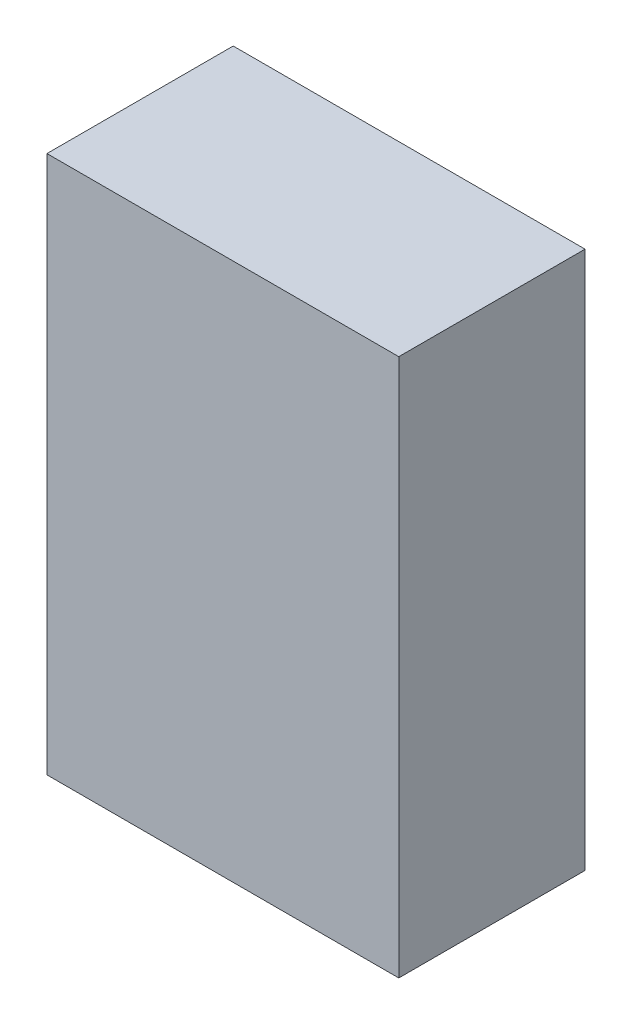
ISO-10303-21;
HEADER;
FILE_DESCRIPTION(('STEP AP214'),'2;1');
FILE_NAME('part.step','',(''),(''),'','','');
FILE_SCHEMA(('AUTOMOTIVE_DESIGN { 1 0 10303 214 1 1 1 1 }'));
ENDSEC;
DATA;
#1=APPLICATION_CONTEXT('core data for automotive mechanical design processes');
#2=APPLICATION_PROTOCOL_DEFINITION('international standard','automotive_design',2000,#1);
#3=PRODUCT_CONTEXT('',#1,'mechanical');
#4=PRODUCT('Part','Part','',(#3));
#5=PRODUCT_RELATED_PRODUCT_CATEGORY('part','',(#4));
#6=PRODUCT_DEFINITION_FORMATION('','',#4);
#7=PRODUCT_DEFINITION_CONTEXT('part definition',#1,'design');
#8=PRODUCT_DEFINITION('design','',#6,#7);
#9=PRODUCT_DEFINITION_SHAPE('','',#8);
#10=(LENGTH_UNIT() NAMED_UNIT(*) SI_UNIT(.MILLI.,.METRE.));
#11=(NAMED_UNIT(*) PLANE_ANGLE_UNIT() SI_UNIT($,.RADIAN.));
#12=(NAMED_UNIT(*) SI_UNIT($,.STERADIAN.) SOLID_ANGLE_UNIT());
#13=UNCERTAINTY_MEASURE_WITH_UNIT(LENGTH_MEASURE(1.E-05),#10,'distance_accuracy_value','');
#14=(GEOMETRIC_REPRESENTATION_CONTEXT(3) GLOBAL_UNCERTAINTY_ASSIGNED_CONTEXT((#13)) GLOBAL_UNIT_ASSIGNED_CONTEXT((#10,
#11,#12)) REPRESENTATION_CONTEXT('',''));
#15=CARTESIAN_POINT('',(0.,0.,0.));
#16=DIRECTION('',(0.,0.,1.));
#17=DIRECTION('',(1.,0.,0.));
#18=AXIS2_PLACEMENT_3D('',#15,#16,#17);
#19=CARTESIAN_POINT('',(-17.,-26.,-18.));
#20=DIRECTION('',(-1.,0.,0.));
#21=DIRECTION('',(0.,0.,1.));
#22=AXIS2_PLACEMENT_3D('',#19,#20,#21);
#23=PLANE('',#22);
#24=DIRECTION('',(0.,-1.,0.));
#25=VECTOR('',#24,1.);
#26=CARTESIAN_POINT('',(-17.,-26.,0.));
#27=LINE('',#26,#25);
#28=CARTESIAN_POINT('',(-17.,26.,0.));
#29=VERTEX_POINT('',#28);
#30=CARTESIAN_POINT('',(-17.,-26.,0.));
#31=VERTEX_POINT('',#30);
#32=EDGE_CURVE('E103',#29,#31,#27,.T.);
#33=ORIENTED_EDGE('',*,*,#32,.F.);
#34=DIRECTION('',(0.,0.,1.));
#35=VECTOR('',#34,1.);
#36=CARTESIAN_POINT('',(-17.,26.,-18.));
#37=LINE('',#36,#35);
#38=CARTESIAN_POINT('',(-17.,26.,-18.));
#39=VERTEX_POINT('',#38);
#40=EDGE_CURVE('E11',#39,#29,#37,.T.);
#41=ORIENTED_EDGE('',*,*,#40,.F.);
#42=DIRECTION('',(0.,-1.,0.));
#43=VECTOR('',#42,1.);
#44=CARTESIAN_POINT('',(-17.,-26.,-18.));
#45=LINE('',#44,#43);
#46=CARTESIAN_POINT('',(-17.,-26.,-18.));
#47=VERTEX_POINT('',#46);
#48=EDGE_CURVE('E97',#39,#47,#45,.T.);
#49=ORIENTED_EDGE('',*,*,#48,.T.);
#50=DIRECTION('',(0.,0.,1.));
#51=VECTOR('',#50,1.);
#52=CARTESIAN_POINT('',(-17.,-26.,-18.));
#53=LINE('',#52,#51);
#54=EDGE_CURVE('E42',#47,#31,#53,.T.);
#55=ORIENTED_EDGE('',*,*,#54,.T.);
#56=EDGE_LOOP('',(#33,#41,#49,#55));
#57=FACE_BOUND('',#56,.T.);
#58=ADVANCED_FACE('F39',(#57),#23,.T.);
#59=CARTESIAN_POINT('',(-17.,26.,-18.));
#60=DIRECTION('',(0.,1.,0.));
#61=DIRECTION('',(0.,0.,1.));
#62=AXIS2_PLACEMENT_3D('',#59,#60,#61);
#63=PLANE('',#62);
#64=DIRECTION('',(-1.,0.,0.));
#65=VECTOR('',#64,1.);
#66=CARTESIAN_POINT('',(-17.,26.,0.));
#67=LINE('',#66,#65);
#68=CARTESIAN_POINT('',(17.,26.,0.));
#69=VERTEX_POINT('',#68);
#70=EDGE_CURVE('E99',#69,#29,#67,.T.);
#71=ORIENTED_EDGE('',*,*,#70,.F.);
#72=DIRECTION('',(0.,0.,1.));
#73=VECTOR('',#72,1.);
#74=CARTESIAN_POINT('',(17.,26.,-18.));
#75=LINE('',#74,#73);
#76=CARTESIAN_POINT('',(17.,26.,-18.));
#77=VERTEX_POINT('',#76);
#78=EDGE_CURVE('E48',#77,#69,#75,.T.);
#79=ORIENTED_EDGE('',*,*,#78,.F.);
#80=DIRECTION('',(-1.,0.,0.));
#81=VECTOR('',#80,1.);
#82=CARTESIAN_POINT('',(-17.,26.,-18.));
#83=LINE('',#82,#81);
#84=EDGE_CURVE('E94',#77,#39,#83,.T.);
#85=ORIENTED_EDGE('',*,*,#84,.T.);
#86=ORIENTED_EDGE('',*,*,#40,.T.);
#87=EDGE_LOOP('',(#71,#79,#85,#86));
#88=FACE_BOUND('',#87,.T.);
#89=ADVANCED_FACE('F113',(#88),#63,.T.);
#90=CARTESIAN_POINT('',(17.,-26.,-18.));
#91=DIRECTION('',(1.,0.,0.));
#92=DIRECTION('',(0.,0.,-1.));
#93=AXIS2_PLACEMENT_3D('',#90,#91,#92);
#94=PLANE('',#93);
#95=DIRECTION('',(0.,1.,0.));
#96=VECTOR('',#95,1.);
#97=CARTESIAN_POINT('',(17.,-26.,0.));
#98=LINE('',#97,#96);
#99=CARTESIAN_POINT('',(17.,-26.,0.));
#100=VERTEX_POINT('',#99);
#101=EDGE_CURVE('E89',#100,#69,#98,.T.);
#102=ORIENTED_EDGE('',*,*,#101,.F.);
#103=DIRECTION('',(0.,0.,1.));
#104=VECTOR('',#103,1.);
#105=CARTESIAN_POINT('',(17.,-26.,-18.));
#106=LINE('',#105,#104);
#107=CARTESIAN_POINT('',(17.,-26.,-18.));
#108=VERTEX_POINT('',#107);
#109=EDGE_CURVE('E84',#108,#100,#106,.T.);
#110=ORIENTED_EDGE('',*,*,#109,.F.);
#111=DIRECTION('',(0.,1.,0.));
#112=VECTOR('',#111,1.);
#113=CARTESIAN_POINT('',(17.,-26.,-18.));
#114=LINE('',#113,#112);
#115=EDGE_CURVE('E87',#108,#77,#114,.T.);
#116=ORIENTED_EDGE('',*,*,#115,.T.);
#117=ORIENTED_EDGE('',*,*,#78,.T.);
#118=EDGE_LOOP('',(#102,#110,#116,#117));
#119=FACE_BOUND('',#118,.T.);
#120=ADVANCED_FACE('F86',(#119),#94,.T.);
#121=CARTESIAN_POINT('',(-17.,-26.,-18.));
#122=DIRECTION('',(0.,-1.,0.));
#123=DIRECTION('',(0.,0.,-1.));
#124=AXIS2_PLACEMENT_3D('',#121,#122,#123);
#125=PLANE('',#124);
#126=DIRECTION('',(1.,0.,0.));
#127=VECTOR('',#126,1.);
#128=CARTESIAN_POINT('',(-17.,-26.,0.));
#129=LINE('',#128,#127);
#130=EDGE_CURVE('E106',#31,#100,#129,.T.);
#131=ORIENTED_EDGE('',*,*,#130,.F.);
#132=ORIENTED_EDGE('',*,*,#54,.F.);
#133=DIRECTION('',(1.,0.,0.));
#134=VECTOR('',#133,1.);
#135=CARTESIAN_POINT('',(-17.,-26.,-18.));
#136=LINE('',#135,#134);
#137=EDGE_CURVE('E93',#47,#108,#136,.T.);
#138=ORIENTED_EDGE('',*,*,#137,.T.);
#139=ORIENTED_EDGE('',*,*,#109,.T.);
#140=EDGE_LOOP('',(#131,#132,#138,#139));
#141=FACE_BOUND('',#140,.T.);
#142=ADVANCED_FACE('F96',(#141),#125,.T.);
#143=CARTESIAN_POINT('',(0.,0.,-18.));
#144=DIRECTION('',(0.,0.,-1.));
#145=DIRECTION('',(-1.,0.,0.));
#146=AXIS2_PLACEMENT_3D('',#143,#144,#145);
#147=PLANE('',#146);
#148=ORIENTED_EDGE('',*,*,#48,.F.);
#149=ORIENTED_EDGE('',*,*,#84,.F.);
#150=ORIENTED_EDGE('',*,*,#115,.F.);
#151=ORIENTED_EDGE('',*,*,#137,.F.);
#152=EDGE_LOOP('',(#148,#149,#150,#151));
#153=FACE_BOUND('',#152,.T.);
#154=ADVANCED_FACE('F92',(#153),#147,.T.);
#155=CARTESIAN_POINT('',(0.,0.,0.));
#156=DIRECTION('',(0.,0.,-1.));
#157=DIRECTION('',(-1.,0.,0.));
#158=AXIS2_PLACEMENT_3D('',#155,#156,#157);
#159=PLANE('',#158);
#160=ORIENTED_EDGE('',*,*,#32,.T.);
#161=ORIENTED_EDGE('',*,*,#130,.T.);
#162=ORIENTED_EDGE('',*,*,#101,.T.);
#163=ORIENTED_EDGE('',*,*,#70,.T.);
#164=EDGE_LOOP('',(#160,#161,#162,#163));
#165=FACE_BOUND('',#164,.T.);
#166=ADVANCED_FACE('F112',(#165),#159,.F.);
#167=CLOSED_SHELL('',(#58,#89,#120,#142,#154,#166));
#168=MANIFOLD_SOLID_BREP('B2',#167);
#169=ADVANCED_BREP_SHAPE_REPRESENTATION('',(#18,#168),#14);
#170=SHAPE_DEFINITION_REPRESENTATION(#9,#169);
ENDSEC;
END-ISO-10303-21;
